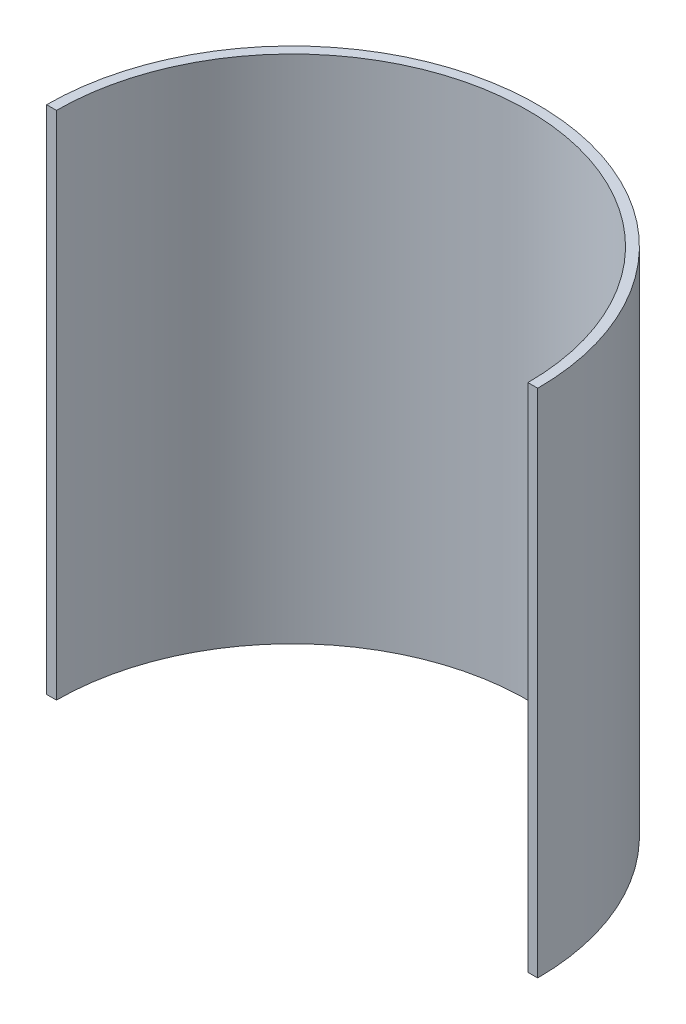
ISO-10303-21;
HEADER;
FILE_DESCRIPTION(('STEP AP214'),'2;1');
FILE_NAME('part.step','',(''),(''),'','','');
FILE_SCHEMA(('AUTOMOTIVE_DESIGN { 1 0 10303 214 1 1 1 1 }'));
ENDSEC;
DATA;
#1=APPLICATION_CONTEXT('core data for automotive mechanical design processes');
#2=APPLICATION_PROTOCOL_DEFINITION('international standard','automotive_design',2000,#1);
#3=PRODUCT_CONTEXT('',#1,'mechanical');
#4=PRODUCT('Part','Part','',(#3));
#5=PRODUCT_RELATED_PRODUCT_CATEGORY('part','',(#4));
#6=PRODUCT_DEFINITION_FORMATION('','',#4);
#7=PRODUCT_DEFINITION_CONTEXT('part definition',#1,'design');
#8=PRODUCT_DEFINITION('design','',#6,#7);
#9=PRODUCT_DEFINITION_SHAPE('','',#8);
#10=(LENGTH_UNIT() NAMED_UNIT(*) SI_UNIT(.MILLI.,.METRE.));
#11=(NAMED_UNIT(*) PLANE_ANGLE_UNIT() SI_UNIT($,.RADIAN.));
#12=(NAMED_UNIT(*) SI_UNIT($,.STERADIAN.) SOLID_ANGLE_UNIT());
#13=UNCERTAINTY_MEASURE_WITH_UNIT(LENGTH_MEASURE(1.E-05),#10,'distance_accuracy_value','');
#14=(GEOMETRIC_REPRESENTATION_CONTEXT(3) GLOBAL_UNCERTAINTY_ASSIGNED_CONTEXT((#13)) GLOBAL_UNIT_ASSIGNED_CONTEXT((#10,
#11,#12)) REPRESENTATION_CONTEXT('',''));
#15=CARTESIAN_POINT('',(0.,0.,0.));
#16=DIRECTION('',(0.,0.,1.));
#17=DIRECTION('',(1.,0.,0.));
#18=AXIS2_PLACEMENT_3D('',#15,#16,#17);
#19=CARTESIAN_POINT('',(0.,26.,0.));
#20=DIRECTION('',(0.,-1.,0.));
#21=DIRECTION('',(0.,0.,1.));
#22=AXIS2_PLACEMENT_3D('',#19,#20,#21);
#23=CYLINDRICAL_SURFACE('',#22,12.5);
#24=CARTESIAN_POINT('',(0.,0.,0.));
#25=DIRECTION('',(0.,-1.,0.));
#26=DIRECTION('',(0.,0.,-1.));
#27=AXIS2_PLACEMENT_3D('',#24,#25,#26);
#28=CIRCLE('',#27,12.5);
#29=CARTESIAN_POINT('',(-12.5,0.,0.));
#30=VERTEX_POINT('',#29);
#31=CARTESIAN_POINT('',(12.5,0.,0.));
#32=VERTEX_POINT('',#31);
#33=EDGE_CURVE('E100',#30,#32,#28,.T.);
#34=ORIENTED_EDGE('',*,*,#33,.F.);
#35=DIRECTION('',(0.,-1.,0.));
#36=VECTOR('',#35,1.);
#37=CARTESIAN_POINT('',(-12.5,26.,0.));
#38=LINE('',#37,#36);
#39=CARTESIAN_POINT('',(-12.5,26.,0.));
#40=VERTEX_POINT('',#39);
#41=EDGE_CURVE('E99',#40,#30,#38,.T.);
#42=ORIENTED_EDGE('',*,*,#41,.F.);
#43=CARTESIAN_POINT('',(0.,26.,0.));
#44=DIRECTION('',(0.,-1.,0.));
#45=DIRECTION('',(0.,0.,-1.));
#46=AXIS2_PLACEMENT_3D('',#43,#44,#45);
#47=CIRCLE('',#46,12.5);
#48=CARTESIAN_POINT('',(12.5,26.,0.));
#49=VERTEX_POINT('',#48);
#50=EDGE_CURVE('E94',#40,#49,#47,.T.);
#51=ORIENTED_EDGE('',*,*,#50,.T.);
#52=DIRECTION('',(0.,-1.,0.));
#53=VECTOR('',#52,1.);
#54=CARTESIAN_POINT('',(12.5,26.,0.));
#55=LINE('',#54,#53);
#56=EDGE_CURVE('E11',#49,#32,#55,.T.);
#57=ORIENTED_EDGE('',*,*,#56,.T.);
#58=EDGE_LOOP('',(#34,#42,#51,#57));
#59=FACE_BOUND('',#58,.T.);
#60=ADVANCED_FACE('F37',(#59),#23,.T.);
#61=CARTESIAN_POINT('',(12.,26.,0.));
#62=DIRECTION('',(0.,0.,-1.));
#63=DIRECTION('',(1.,0.,0.));
#64=AXIS2_PLACEMENT_3D('',#61,#62,#63);
#65=PLANE('',#64);
#66=DIRECTION('',(-1.,0.,0.));
#67=VECTOR('',#66,1.);
#68=CARTESIAN_POINT('',(12.,0.,0.));
#69=LINE('',#68,#67);
#70=CARTESIAN_POINT('',(12.,0.,0.));
#71=VERTEX_POINT('',#70);
#72=EDGE_CURVE('E102',#32,#71,#69,.T.);
#73=ORIENTED_EDGE('',*,*,#72,.F.);
#74=ORIENTED_EDGE('',*,*,#56,.F.);
#75=DIRECTION('',(-1.,0.,0.));
#76=VECTOR('',#75,1.);
#77=CARTESIAN_POINT('',(12.,26.,0.));
#78=LINE('',#77,#76);
#79=CARTESIAN_POINT('',(12.,26.,0.));
#80=VERTEX_POINT('',#79);
#81=EDGE_CURVE('E78',#49,#80,#78,.T.);
#82=ORIENTED_EDGE('',*,*,#81,.T.);
#83=DIRECTION('',(0.,-1.,0.));
#84=VECTOR('',#83,1.);
#85=CARTESIAN_POINT('',(12.,26.,0.));
#86=LINE('',#85,#84);
#87=EDGE_CURVE('E45',#80,#71,#86,.T.);
#88=ORIENTED_EDGE('',*,*,#87,.T.);
#89=EDGE_LOOP('',(#73,#74,#82,#88));
#90=FACE_BOUND('',#89,.T.);
#91=ADVANCED_FACE('F92',(#90),#65,.F.);
#92=CARTESIAN_POINT('',(0.,26.,0.));
#93=DIRECTION('',(0.,-1.,0.));
#94=DIRECTION('',(0.,0.,1.));
#95=AXIS2_PLACEMENT_3D('',#92,#93,#94);
#96=CYLINDRICAL_SURFACE('',#95,12.);
#97=CARTESIAN_POINT('',(0.,0.,0.));
#98=DIRECTION('',(0.,1.,0.));
#99=DIRECTION('',(0.,0.,-1.));
#100=AXIS2_PLACEMENT_3D('',#97,#98,#99);
#101=CIRCLE('',#100,12.);
#102=CARTESIAN_POINT('',(-12.,0.,0.));
#103=VERTEX_POINT('',#102);
#104=EDGE_CURVE('E88',#71,#103,#101,.T.);
#105=ORIENTED_EDGE('',*,*,#104,.F.);
#106=ORIENTED_EDGE('',*,*,#87,.F.);
#107=CARTESIAN_POINT('',(0.,26.,0.));
#108=DIRECTION('',(0.,1.,0.));
#109=DIRECTION('',(0.,0.,-1.));
#110=AXIS2_PLACEMENT_3D('',#107,#108,#109);
#111=CIRCLE('',#110,12.);
#112=CARTESIAN_POINT('',(-12.,26.,0.));
#113=VERTEX_POINT('',#112);
#114=EDGE_CURVE('E81',#80,#113,#111,.T.);
#115=ORIENTED_EDGE('',*,*,#114,.T.);
#116=DIRECTION('',(0.,-1.,0.));
#117=VECTOR('',#116,1.);
#118=CARTESIAN_POINT('',(-12.,26.,0.));
#119=LINE('',#118,#117);
#120=EDGE_CURVE('E91',#113,#103,#119,.T.);
#121=ORIENTED_EDGE('',*,*,#120,.T.);
#122=EDGE_LOOP('',(#105,#106,#115,#121));
#123=FACE_BOUND('',#122,.T.);
#124=ADVANCED_FACE('F87',(#123),#96,.F.);
#125=CARTESIAN_POINT('',(-12.5,26.,0.));
#126=DIRECTION('',(0.,0.,-1.));
#127=DIRECTION('',(1.,0.,0.));
#128=AXIS2_PLACEMENT_3D('',#125,#126,#127);
#129=PLANE('',#128);
#130=DIRECTION('',(-1.,0.,0.));
#131=VECTOR('',#130,1.);
#132=CARTESIAN_POINT('',(-12.5,0.,0.));
#133=LINE('',#132,#131);
#134=EDGE_CURVE('E67',#103,#30,#133,.T.);
#135=ORIENTED_EDGE('',*,*,#134,.F.);
#136=ORIENTED_EDGE('',*,*,#120,.F.);
#137=DIRECTION('',(-1.,0.,0.));
#138=VECTOR('',#137,1.);
#139=CARTESIAN_POINT('',(-12.5,26.,0.));
#140=LINE('',#139,#138);
#141=EDGE_CURVE('E53',#113,#40,#140,.T.);
#142=ORIENTED_EDGE('',*,*,#141,.T.);
#143=ORIENTED_EDGE('',*,*,#41,.T.);
#144=EDGE_LOOP('',(#135,#136,#142,#143));
#145=FACE_BOUND('',#144,.T.);
#146=ADVANCED_FACE('F111',(#145),#129,.F.);
#147=CARTESIAN_POINT('',(0.,26.,0.));
#148=DIRECTION('',(0.,1.,0.));
#149=DIRECTION('',(0.,0.,-1.));
#150=AXIS2_PLACEMENT_3D('',#147,#148,#149);
#151=PLANE('',#150);
#152=ORIENTED_EDGE('',*,*,#50,.F.);
#153=ORIENTED_EDGE('',*,*,#141,.F.);
#154=ORIENTED_EDGE('',*,*,#114,.F.);
#155=ORIENTED_EDGE('',*,*,#81,.F.);
#156=EDGE_LOOP('',(#152,#153,#154,#155));
#157=FACE_BOUND('',#156,.T.);
#158=ADVANCED_FACE('F83',(#157),#151,.T.);
#159=CARTESIAN_POINT('',(0.,0.,0.));
#160=DIRECTION('',(0.,1.,0.));
#161=DIRECTION('',(0.,0.,-1.));
#162=AXIS2_PLACEMENT_3D('',#159,#160,#161);
#163=PLANE('',#162);
#164=ORIENTED_EDGE('',*,*,#33,.T.);
#165=ORIENTED_EDGE('',*,*,#72,.T.);
#166=ORIENTED_EDGE('',*,*,#104,.T.);
#167=ORIENTED_EDGE('',*,*,#134,.T.);
#168=EDGE_LOOP('',(#164,#165,#166,#167));
#169=FACE_BOUND('',#168,.T.);
#170=ADVANCED_FACE('F107',(#169),#163,.F.);
#171=CLOSED_SHELL('',(#60,#91,#124,#146,#158,#170));
#172=MANIFOLD_SOLID_BREP('B2',#171);
#173=ADVANCED_BREP_SHAPE_REPRESENTATION('',(#18,#172),#14);
#174=SHAPE_DEFINITION_REPRESENTATION(#9,#173);
ENDSEC;
END-ISO-10303-21;
